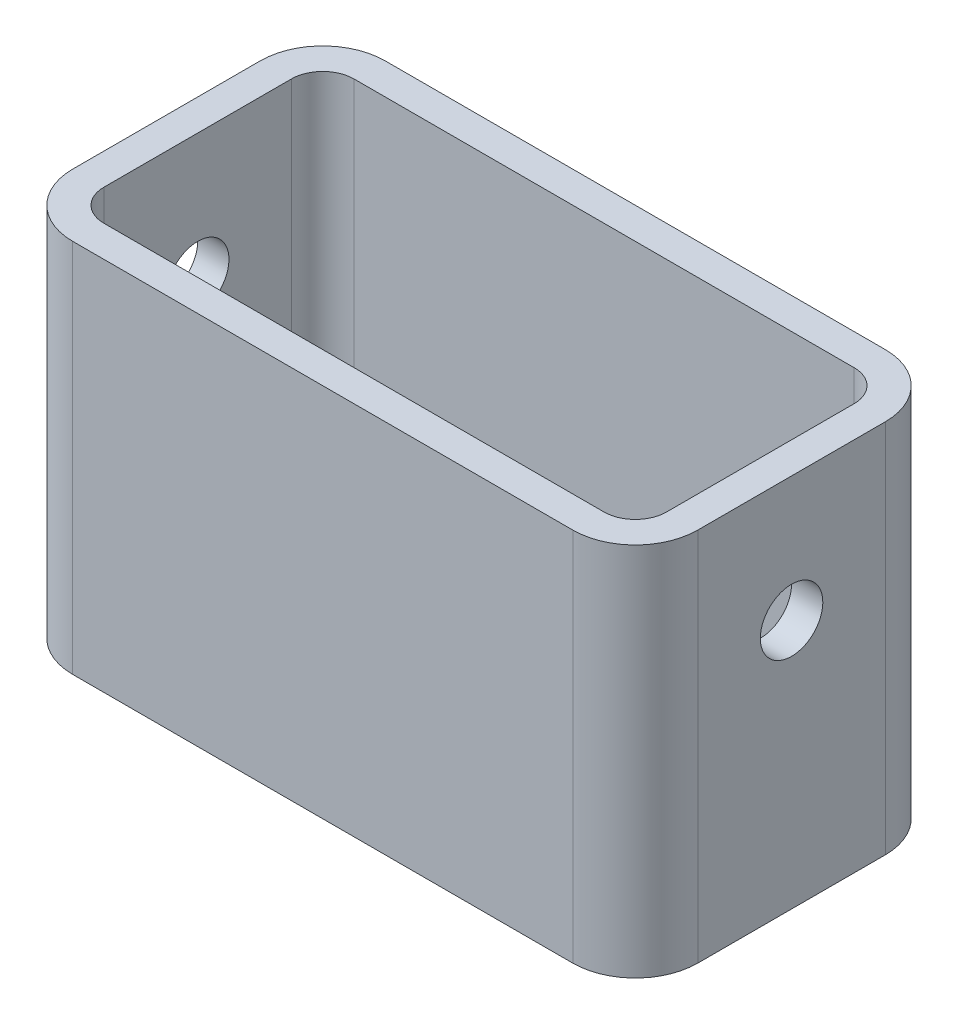
ISO-10303-21;
HEADER;
FILE_DESCRIPTION(('STEP AP214'),'2;1');
FILE_NAME('part.step','',(''),(''),'','','');
FILE_SCHEMA(('AUTOMOTIVE_DESIGN { 1 0 10303 214 1 1 1 1 }'));
ENDSEC;
DATA;
#1=APPLICATION_CONTEXT('core data for automotive mechanical design processes');
#2=APPLICATION_PROTOCOL_DEFINITION('international standard','automotive_design',2000,#1);
#3=PRODUCT_CONTEXT('',#1,'mechanical');
#4=PRODUCT('Part','Part','',(#3));
#5=PRODUCT_RELATED_PRODUCT_CATEGORY('part','',(#4));
#6=PRODUCT_DEFINITION_FORMATION('','',#4);
#7=PRODUCT_DEFINITION_CONTEXT('part definition',#1,'design');
#8=PRODUCT_DEFINITION('design','',#6,#7);
#9=PRODUCT_DEFINITION_SHAPE('','',#8);
#10=(LENGTH_UNIT() NAMED_UNIT(*) SI_UNIT(.MILLI.,.METRE.));
#11=(NAMED_UNIT(*) PLANE_ANGLE_UNIT() SI_UNIT($,.RADIAN.));
#12=(NAMED_UNIT(*) SI_UNIT($,.STERADIAN.) SOLID_ANGLE_UNIT());
#13=UNCERTAINTY_MEASURE_WITH_UNIT(LENGTH_MEASURE(1.E-05),#10,'distance_accuracy_value','');
#14=(GEOMETRIC_REPRESENTATION_CONTEXT(3) GLOBAL_UNCERTAINTY_ASSIGNED_CONTEXT((#13)) GLOBAL_UNIT_ASSIGNED_CONTEXT((#10,
#11,#12)) REPRESENTATION_CONTEXT('',''));
#15=CARTESIAN_POINT('',(0.,0.,0.));
#16=DIRECTION('',(0.,0.,1.));
#17=DIRECTION('',(1.,0.,0.));
#18=AXIS2_PLACEMENT_3D('',#15,#16,#17);
#19=CARTESIAN_POINT('',(-46.5346534653465,26.980198019802,50.));
#20=DIRECTION('',(0.,-1.,0.));
#21=DIRECTION('',(0.,0.,-1.));
#22=AXIS2_PLACEMENT_3D('',#19,#20,#21);
#23=PLANE('',#22);
#24=DIRECTION('',(0.,0.,-1.));
#25=VECTOR('',#24,1.);
#26=CARTESIAN_POINT('',(-46.5346534653465,26.980198019802,50.));
#27=LINE('',#26,#25);
#28=CARTESIAN_POINT('',(-46.5346534653465,26.980198019802,40.));
#29=VERTEX_POINT('',#28);
#30=CARTESIAN_POINT('',(-46.5346534653465,26.980198019802,10.));
#31=VERTEX_POINT('',#30);
#32=EDGE_CURVE('E237',#29,#31,#27,.T.);
#33=ORIENTED_EDGE('',*,*,#32,.F.);
#34=CARTESIAN_POINT('',(-36.5346534653465,26.980198019802,40.));
#35=DIRECTION('',(0.,-1.,0.));
#36=DIRECTION('',(0.,0.,-1.));
#37=AXIS2_PLACEMENT_3D('',#34,#35,#36);
#38=CIRCLE('',#37,10.);
#39=CARTESIAN_POINT('',(-36.5346534653465,26.980198019802,50.));
#40=VERTEX_POINT('',#39);
#41=EDGE_CURVE('E299',#29,#40,#38,.F.);
#42=ORIENTED_EDGE('',*,*,#41,.T.);
#43=DIRECTION('',(-1.,0.,0.));
#44=VECTOR('',#43,1.);
#45=CARTESIAN_POINT('',(-46.5346534653465,26.980198019802,50.));
#46=LINE('',#45,#44);
#47=CARTESIAN_POINT('',(43.4653465346535,26.980198019802,50.));
#48=VERTEX_POINT('',#47);
#49=EDGE_CURVE('E232',#48,#40,#46,.T.);
#50=ORIENTED_EDGE('',*,*,#49,.F.);
#51=CARTESIAN_POINT('',(43.4653465346535,26.980198019802,40.));
#52=DIRECTION('',(0.,-1.,0.));
#53=DIRECTION('',(0.,0.,-1.));
#54=AXIS2_PLACEMENT_3D('',#51,#52,#53);
#55=CIRCLE('',#54,10.);
#56=CARTESIAN_POINT('',(53.4653465346535,26.980198019802,40.));
#57=VERTEX_POINT('',#56);
#58=EDGE_CURVE('E263',#48,#57,#55,.F.);
#59=ORIENTED_EDGE('',*,*,#58,.T.);
#60=DIRECTION('',(0.,0.,-1.));
#61=VECTOR('',#60,1.);
#62=CARTESIAN_POINT('',(53.4653465346535,26.980198019802,50.));
#63=LINE('',#62,#61);
#64=CARTESIAN_POINT('',(53.4653465346535,26.980198019802,10.));
#65=VERTEX_POINT('',#64);
#66=EDGE_CURVE('E247',#57,#65,#63,.T.);
#67=ORIENTED_EDGE('',*,*,#66,.T.);
#68=CARTESIAN_POINT('',(43.4653465346535,26.980198019802,10.));
#69=DIRECTION('',(0.,-1.,0.));
#70=DIRECTION('',(0.,0.,-1.));
#71=AXIS2_PLACEMENT_3D('',#68,#69,#70);
#72=CIRCLE('',#71,10.);
#73=CARTESIAN_POINT('',(43.4653465346535,26.980198019802,0.));
#74=VERTEX_POINT('',#73);
#75=EDGE_CURVE('E293',#65,#74,#72,.F.);
#76=ORIENTED_EDGE('',*,*,#75,.T.);
#77=DIRECTION('',(-1.,0.,0.));
#78=VECTOR('',#77,1.);
#79=CARTESIAN_POINT('',(-46.5346534653465,26.980198019802,0.));
#80=LINE('',#79,#78);
#81=CARTESIAN_POINT('',(-36.5346534653465,26.980198019802,0.));
#82=VERTEX_POINT('',#81);
#83=EDGE_CURVE('E233',#74,#82,#80,.T.);
#84=ORIENTED_EDGE('',*,*,#83,.T.);
#85=CARTESIAN_POINT('',(-36.5346534653465,26.980198019802,10.));
#86=DIRECTION('',(0.,-1.,0.));
#87=DIRECTION('',(0.,0.,-1.));
#88=AXIS2_PLACEMENT_3D('',#85,#86,#87);
#89=CIRCLE('',#88,10.);
#90=EDGE_CURVE('E296',#82,#31,#89,.F.);
#91=ORIENTED_EDGE('',*,*,#90,.T.);
#92=EDGE_LOOP('',(#33,#42,#50,#59,#67,#76,#84,#91));
#93=FACE_BOUND('',#92,.T.);
#94=CARTESIAN_POINT('',(-36.5346534653465,26.980198019802,40.));
#95=DIRECTION('',(0.,-1.,0.));
#96=DIRECTION('',(0.,0.,-1.));
#97=AXIS2_PLACEMENT_3D('',#94,#95,#96);
#98=CIRCLE('',#97,5.);
#99=CARTESIAN_POINT('',(-41.5346534653465,26.980198019802,40.));
#100=VERTEX_POINT('',#99);
#101=CARTESIAN_POINT('',(-36.5346534653465,26.980198019802,45.));
#102=VERTEX_POINT('',#101);
#103=EDGE_CURVE('E203',#100,#102,#98,.F.);
#104=ORIENTED_EDGE('',*,*,#103,.F.);
#105=DIRECTION('',(0.,0.,-1.));
#106=VECTOR('',#105,1.);
#107=CARTESIAN_POINT('',(-41.5346534653465,26.980198019802,50.));
#108=LINE('',#107,#106);
#109=CARTESIAN_POINT('',(-41.5346534653465,26.980198019802,10.));
#110=VERTEX_POINT('',#109);
#111=EDGE_CURVE('E207',#100,#110,#108,.T.);
#112=ORIENTED_EDGE('',*,*,#111,.T.);
#113=CARTESIAN_POINT('',(-36.5346534653465,26.980198019802,10.));
#114=DIRECTION('',(0.,-1.,0.));
#115=DIRECTION('',(0.,0.,-1.));
#116=AXIS2_PLACEMENT_3D('',#113,#114,#115);
#117=CIRCLE('',#116,5.);
#118=CARTESIAN_POINT('',(-36.5346534653465,26.980198019802,5.));
#119=VERTEX_POINT('',#118);
#120=EDGE_CURVE('E214',#119,#110,#117,.F.);
#121=ORIENTED_EDGE('',*,*,#120,.F.);
#122=DIRECTION('',(-1.,0.,0.));
#123=VECTOR('',#122,1.);
#124=CARTESIAN_POINT('',(-46.5346534653465,26.980198019802,5.));
#125=LINE('',#124,#123);
#126=CARTESIAN_POINT('',(43.4653465346535,26.980198019802,5.));
#127=VERTEX_POINT('',#126);
#128=EDGE_CURVE('E55',#127,#119,#125,.T.);
#129=ORIENTED_EDGE('',*,*,#128,.F.);
#130=CARTESIAN_POINT('',(43.4653465346535,26.980198019802,10.));
#131=DIRECTION('',(0.,-1.,0.));
#132=DIRECTION('',(0.,0.,-1.));
#133=AXIS2_PLACEMENT_3D('',#130,#131,#132);
#134=CIRCLE('',#133,5.);
#135=CARTESIAN_POINT('',(48.4653465346535,26.980198019802,10.));
#136=VERTEX_POINT('',#135);
#137=EDGE_CURVE('E220',#136,#127,#134,.F.);
#138=ORIENTED_EDGE('',*,*,#137,.F.);
#139=DIRECTION('',(0.,0.,-1.));
#140=VECTOR('',#139,1.);
#141=CARTESIAN_POINT('',(48.4653465346535,26.980198019802,50.));
#142=LINE('',#141,#140);
#143=CARTESIAN_POINT('',(48.4653465346535,26.980198019802,40.));
#144=VERTEX_POINT('',#143);
#145=EDGE_CURVE('E211',#144,#136,#142,.T.);
#146=ORIENTED_EDGE('',*,*,#145,.F.);
#147=CARTESIAN_POINT('',(43.4653465346535,26.980198019802,40.));
#148=DIRECTION('',(0.,-1.,0.));
#149=DIRECTION('',(0.,0.,-1.));
#150=AXIS2_PLACEMENT_3D('',#147,#148,#149);
#151=CIRCLE('',#150,5.);
#152=CARTESIAN_POINT('',(43.4653465346535,26.980198019802,45.));
#153=VERTEX_POINT('',#152);
#154=EDGE_CURVE('E184',#153,#144,#151,.F.);
#155=ORIENTED_EDGE('',*,*,#154,.F.);
#156=DIRECTION('',(-1.,0.,0.));
#157=VECTOR('',#156,1.);
#158=CARTESIAN_POINT('',(-46.5346534653465,26.980198019802,45.));
#159=LINE('',#158,#157);
#160=EDGE_CURVE('E168',#153,#102,#159,.T.);
#161=ORIENTED_EDGE('',*,*,#160,.T.);
#162=EDGE_LOOP('',(#104,#112,#121,#129,#138,#146,#155,#161));
#163=FACE_BOUND('',#162,.T.);
#164=ADVANCED_FACE('F38',(#93,#163),#23,.F.);
#165=CARTESIAN_POINT('',(-46.5346534653465,26.980198019802,50.));
#166=DIRECTION('',(1.,0.,0.));
#167=DIRECTION('',(0.,1.,0.));
#168=AXIS2_PLACEMENT_3D('',#165,#166,#167);
#169=PLANE('',#168);
#170=CARTESIAN_POINT('',(-46.5346534653465,6.98019801980195,25.));
#171=DIRECTION('',(1.,0.,0.));
#172=DIRECTION('',(0.,1.,0.));
#173=AXIS2_PLACEMENT_3D('',#170,#171,#172);
#174=CIRCLE('',#173,5.);
#175=CARTESIAN_POINT('',(-46.5346534653465,11.980198019802,25.));
#176=VERTEX_POINT('',#175);
#177=EDGE_CURVE('E354',#176,#176,#174,.T.);
#178=ORIENTED_EDGE('',*,*,#177,.T.);
#179=EDGE_LOOP('',(#178));
#180=FACE_BOUND('',#179,.T.);
#181=DIRECTION('',(0.,0.,-1.));
#182=VECTOR('',#181,1.);
#183=CARTESIAN_POINT('',(-46.5346534653465,-33.019801980198,50.));
#184=LINE('',#183,#182);
#185=CARTESIAN_POINT('',(-46.5346534653465,-33.019801980198,40.));
#186=VERTEX_POINT('',#185);
#187=CARTESIAN_POINT('',(-46.5346534653465,-33.019801980198,10.));
#188=VERTEX_POINT('',#187);
#189=EDGE_CURVE('E255',#186,#188,#184,.T.);
#190=ORIENTED_EDGE('',*,*,#189,.F.);
#191=DIRECTION('',(0.,-1.,0.));
#192=VECTOR('',#191,1.);
#193=CARTESIAN_POINT('',(-46.5346534653465,26.980198019802,40.));
#194=LINE('',#193,#192);
#195=EDGE_CURVE('E290',#186,#29,#194,.F.);
#196=ORIENTED_EDGE('',*,*,#195,.T.);
#197=ORIENTED_EDGE('',*,*,#32,.T.);
#198=DIRECTION('',(0.,-1.,0.));
#199=VECTOR('',#198,1.);
#200=CARTESIAN_POINT('',(-46.5346534653465,26.980198019802,10.));
#201=LINE('',#200,#199);
#202=EDGE_CURVE('E286',#31,#188,#201,.T.);
#203=ORIENTED_EDGE('',*,*,#202,.T.);
#204=EDGE_LOOP('',(#190,#196,#197,#203));
#205=FACE_BOUND('',#204,.T.);
#206=ADVANCED_FACE('F364',(#180,#205),#169,.F.);
#207=CARTESIAN_POINT('',(-46.5346534653465,-33.019801980198,50.));
#208=DIRECTION('',(0.,1.,0.));
#209=DIRECTION('',(0.,0.,1.));
#210=AXIS2_PLACEMENT_3D('',#207,#208,#209);
#211=PLANE('',#210);
#212=DIRECTION('',(1.,0.,0.));
#213=VECTOR('',#212,1.);
#214=CARTESIAN_POINT('',(-46.5346534653465,-33.019801980198,50.));
#215=LINE('',#214,#213);
#216=CARTESIAN_POINT('',(-36.5346534653465,-33.019801980198,50.));
#217=VERTEX_POINT('',#216);
#218=CARTESIAN_POINT('',(43.4653465346535,-33.019801980198,50.));
#219=VERTEX_POINT('',#218);
#220=EDGE_CURVE('E229',#217,#219,#215,.T.);
#221=ORIENTED_EDGE('',*,*,#220,.F.);
#222=CARTESIAN_POINT('',(-36.5346534653465,-33.019801980198,40.));
#223=DIRECTION('',(0.,1.,0.));
#224=DIRECTION('',(0.,0.,1.));
#225=AXIS2_PLACEMENT_3D('',#222,#223,#224);
#226=CIRCLE('',#225,10.);
#227=EDGE_CURVE('E283',#217,#186,#226,.F.);
#228=ORIENTED_EDGE('',*,*,#227,.T.);
#229=ORIENTED_EDGE('',*,*,#189,.T.);
#230=CARTESIAN_POINT('',(-36.5346534653465,-33.019801980198,10.));
#231=DIRECTION('',(0.,1.,0.));
#232=DIRECTION('',(0.,0.,1.));
#233=AXIS2_PLACEMENT_3D('',#230,#231,#232);
#234=CIRCLE('',#233,10.);
#235=CARTESIAN_POINT('',(-36.5346534653465,-33.019801980198,0.));
#236=VERTEX_POINT('',#235);
#237=EDGE_CURVE('E280',#188,#236,#234,.F.);
#238=ORIENTED_EDGE('',*,*,#237,.T.);
#239=DIRECTION('',(1.,0.,0.));
#240=VECTOR('',#239,1.);
#241=CARTESIAN_POINT('',(-46.5346534653465,-33.019801980198,0.));
#242=LINE('',#241,#240);
#243=CARTESIAN_POINT('',(43.4653465346535,-33.019801980198,0.));
#244=VERTEX_POINT('',#243);
#245=EDGE_CURVE('E238',#236,#244,#242,.T.);
#246=ORIENTED_EDGE('',*,*,#245,.T.);
#247=CARTESIAN_POINT('',(43.4653465346535,-33.019801980198,10.));
#248=DIRECTION('',(0.,1.,0.));
#249=DIRECTION('',(0.,0.,1.));
#250=AXIS2_PLACEMENT_3D('',#247,#248,#249);
#251=CIRCLE('',#250,10.);
#252=CARTESIAN_POINT('',(53.4653465346535,-33.019801980198,10.));
#253=VERTEX_POINT('',#252);
#254=EDGE_CURVE('E277',#244,#253,#251,.F.);
#255=ORIENTED_EDGE('',*,*,#254,.T.);
#256=DIRECTION('',(0.,0.,-1.));
#257=VECTOR('',#256,1.);
#258=CARTESIAN_POINT('',(53.4653465346535,-33.019801980198,50.));
#259=LINE('',#258,#257);
#260=CARTESIAN_POINT('',(53.4653465346535,-33.019801980198,40.));
#261=VERTEX_POINT('',#260);
#262=EDGE_CURVE('E251',#261,#253,#259,.T.);
#263=ORIENTED_EDGE('',*,*,#262,.F.);
#264=CARTESIAN_POINT('',(43.4653465346535,-33.019801980198,40.));
#265=DIRECTION('',(0.,1.,0.));
#266=DIRECTION('',(0.,0.,1.));
#267=AXIS2_PLACEMENT_3D('',#264,#265,#266);
#268=CIRCLE('',#267,10.);
#269=EDGE_CURVE('E269',#261,#219,#268,.F.);
#270=ORIENTED_EDGE('',*,*,#269,.T.);
#271=EDGE_LOOP('',(#221,#228,#229,#238,#246,#255,#263,#270));
#272=FACE_BOUND('',#271,.T.);
#273=ADVANCED_FACE('F384',(#272),#211,.F.);
#274=CARTESIAN_POINT('',(53.4653465346535,26.980198019802,50.));
#275=DIRECTION('',(-1.,0.,0.));
#276=DIRECTION('',(0.,-1.,0.));
#277=AXIS2_PLACEMENT_3D('',#274,#275,#276);
#278=PLANE('',#277);
#279=CARTESIAN_POINT('',(53.4653465346535,6.98019801980198,25.));
#280=DIRECTION('',(1.,0.,0.));
#281=DIRECTION('',(0.,1.,0.));
#282=AXIS2_PLACEMENT_3D('',#279,#280,#281);
#283=CIRCLE('',#282,5.);
#284=CARTESIAN_POINT('',(53.4653465346535,11.980198019802,25.));
#285=VERTEX_POINT('',#284);
#286=EDGE_CURVE('E356',#285,#285,#283,.T.);
#287=ORIENTED_EDGE('',*,*,#286,.F.);
#288=EDGE_LOOP('',(#287));
#289=FACE_BOUND('',#288,.T.);
#290=ORIENTED_EDGE('',*,*,#262,.T.);
#291=DIRECTION('',(0.,1.,0.));
#292=VECTOR('',#291,1.);
#293=CARTESIAN_POINT('',(53.4653465346535,26.980198019802,10.));
#294=LINE('',#293,#292);
#295=EDGE_CURVE('E11',#253,#65,#294,.T.);
#296=ORIENTED_EDGE('',*,*,#295,.T.);
#297=ORIENTED_EDGE('',*,*,#66,.F.);
#298=DIRECTION('',(0.,1.,0.));
#299=VECTOR('',#298,1.);
#300=CARTESIAN_POINT('',(53.4653465346535,-33.019801980198,40.));
#301=LINE('',#300,#299);
#302=EDGE_CURVE('E266',#57,#261,#301,.F.);
#303=ORIENTED_EDGE('',*,*,#302,.T.);
#304=EDGE_LOOP('',(#290,#296,#297,#303));
#305=FACE_BOUND('',#304,.T.);
#306=ADVANCED_FACE('F391',(#289,#305),#278,.F.);
#307=CARTESIAN_POINT('',(0.,0.,50.));
#308=DIRECTION('',(0.,0.,1.));
#309=DIRECTION('',(1.,0.,0.));
#310=AXIS2_PLACEMENT_3D('',#307,#308,#309);
#311=PLANE('',#310);
#312=ORIENTED_EDGE('',*,*,#49,.T.);
#313=DIRECTION('',(0.,-1.,0.));
#314=VECTOR('',#313,1.);
#315=CARTESIAN_POINT('',(-36.5346534653465,-33.019801980198,50.));
#316=LINE('',#315,#314);
#317=EDGE_CURVE('E273',#40,#217,#316,.T.);
#318=ORIENTED_EDGE('',*,*,#317,.T.);
#319=ORIENTED_EDGE('',*,*,#220,.T.);
#320=DIRECTION('',(0.,1.,0.));
#321=VECTOR('',#320,1.);
#322=CARTESIAN_POINT('',(43.4653465346535,26.980198019802,50.));
#323=LINE('',#322,#321);
#324=EDGE_CURVE('E259',#219,#48,#323,.T.);
#325=ORIENTED_EDGE('',*,*,#324,.T.);
#326=EDGE_LOOP('',(#312,#318,#319,#325));
#327=FACE_BOUND('',#326,.T.);
#328=ADVANCED_FACE('F394',(#327),#311,.T.);
#329=CARTESIAN_POINT('',(0.,0.,0.));
#330=DIRECTION('',(0.,0.,1.));
#331=DIRECTION('',(1.,0.,0.));
#332=AXIS2_PLACEMENT_3D('',#329,#330,#331);
#333=PLANE('',#332);
#334=ORIENTED_EDGE('',*,*,#245,.F.);
#335=DIRECTION('',(0.,-1.,0.));
#336=VECTOR('',#335,1.);
#337=CARTESIAN_POINT('',(-36.5346534653465,0.,0.));
#338=LINE('',#337,#336);
#339=EDGE_CURVE('E48',#236,#82,#338,.F.);
#340=ORIENTED_EDGE('',*,*,#339,.T.);
#341=ORIENTED_EDGE('',*,*,#83,.F.);
#342=DIRECTION('',(0.,1.,0.));
#343=VECTOR('',#342,1.);
#344=CARTESIAN_POINT('',(43.4653465346535,0.,0.));
#345=LINE('',#344,#343);
#346=EDGE_CURVE('E302',#74,#244,#345,.F.);
#347=ORIENTED_EDGE('',*,*,#346,.T.);
#348=EDGE_LOOP('',(#334,#340,#341,#347));
#349=FACE_BOUND('',#348,.T.);
#350=ADVANCED_FACE('F389',(#349),#333,.F.);
#351=CARTESIAN_POINT('',(43.4653465346535,0.,40.));
#352=DIRECTION('',(0.,-1.,0.));
#353=DIRECTION('',(1.,0.,0.));
#354=AXIS2_PLACEMENT_3D('',#351,#352,#353);
#355=CYLINDRICAL_SURFACE('',#354,10.);
#356=ORIENTED_EDGE('',*,*,#269,.F.);
#357=ORIENTED_EDGE('',*,*,#302,.F.);
#358=ORIENTED_EDGE('',*,*,#58,.F.);
#359=ORIENTED_EDGE('',*,*,#324,.F.);
#360=EDGE_LOOP('',(#356,#357,#358,#359));
#361=FACE_BOUND('',#360,.T.);
#362=ADVANCED_FACE('F399',(#361),#355,.T.);
#363=CARTESIAN_POINT('',(-36.5346534653465,0.,40.));
#364=DIRECTION('',(0.,1.,0.));
#365=DIRECTION('',(-1.,0.,0.));
#366=AXIS2_PLACEMENT_3D('',#363,#364,#365);
#367=CYLINDRICAL_SURFACE('',#366,10.);
#368=ORIENTED_EDGE('',*,*,#41,.F.);
#369=ORIENTED_EDGE('',*,*,#195,.F.);
#370=ORIENTED_EDGE('',*,*,#227,.F.);
#371=ORIENTED_EDGE('',*,*,#317,.F.);
#372=EDGE_LOOP('',(#368,#369,#370,#371));
#373=FACE_BOUND('',#372,.T.);
#374=ADVANCED_FACE('F402',(#373),#367,.T.);
#375=CARTESIAN_POINT('',(-36.5346534653465,26.980198019802,10.));
#376=DIRECTION('',(0.,-1.,0.));
#377=DIRECTION('',(1.,0.,0.));
#378=AXIS2_PLACEMENT_3D('',#375,#376,#377);
#379=CYLINDRICAL_SURFACE('',#378,10.);
#380=ORIENTED_EDGE('',*,*,#90,.F.);
#381=ORIENTED_EDGE('',*,*,#339,.F.);
#382=ORIENTED_EDGE('',*,*,#237,.F.);
#383=ORIENTED_EDGE('',*,*,#202,.F.);
#384=EDGE_LOOP('',(#380,#381,#382,#383));
#385=FACE_BOUND('',#384,.T.);
#386=ADVANCED_FACE('F405',(#385),#379,.T.);
#387=CARTESIAN_POINT('',(43.4653465346535,26.980198019802,10.));
#388=DIRECTION('',(0.,1.,0.));
#389=DIRECTION('',(-1.,0.,0.));
#390=AXIS2_PLACEMENT_3D('',#387,#388,#389);
#391=CYLINDRICAL_SURFACE('',#390,10.);
#392=ORIENTED_EDGE('',*,*,#254,.F.);
#393=ORIENTED_EDGE('',*,*,#346,.F.);
#394=ORIENTED_EDGE('',*,*,#75,.F.);
#395=ORIENTED_EDGE('',*,*,#295,.F.);
#396=EDGE_LOOP('',(#392,#393,#394,#395));
#397=FACE_BOUND('',#396,.T.);
#398=ADVANCED_FACE('F40',(#397),#391,.T.);
#399=CARTESIAN_POINT('',(-41.5346534653465,26.980198019802,50.));
#400=DIRECTION('',(1.,0.,0.));
#401=DIRECTION('',(0.,1.,0.));
#402=AXIS2_PLACEMENT_3D('',#399,#400,#401);
#403=PLANE('',#402);
#404=CARTESIAN_POINT('',(-41.5346534653465,6.98019801980196,25.));
#405=DIRECTION('',(1.,0.,0.));
#406=DIRECTION('',(0.,1.,0.));
#407=AXIS2_PLACEMENT_3D('',#404,#405,#406);
#408=CIRCLE('',#407,5.);
#409=CARTESIAN_POINT('',(-41.5346534653465,11.980198019802,25.));
#410=VERTEX_POINT('',#409);
#411=EDGE_CURVE('E346',#410,#410,#408,.T.);
#412=ORIENTED_EDGE('',*,*,#411,.F.);
#413=EDGE_LOOP('',(#412));
#414=FACE_BOUND('',#413,.T.);
#415=DIRECTION('',(0.,0.,-1.));
#416=VECTOR('',#415,1.);
#417=CARTESIAN_POINT('',(-41.5346534653465,-28.019801980198,50.));
#418=LINE('',#417,#416);
#419=CARTESIAN_POINT('',(-41.5346534653465,-28.019801980198,40.));
#420=VERTEX_POINT('',#419);
#421=CARTESIAN_POINT('',(-41.5346534653465,-28.019801980198,10.));
#422=VERTEX_POINT('',#421);
#423=EDGE_CURVE('E185',#420,#422,#418,.T.);
#424=ORIENTED_EDGE('',*,*,#423,.T.);
#425=DIRECTION('',(0.,1.,0.));
#426=VECTOR('',#425,1.);
#427=CARTESIAN_POINT('',(-41.5346534653465,26.980198019802,10.));
#428=LINE('',#427,#426);
#429=EDGE_CURVE('E309',#110,#422,#428,.F.);
#430=ORIENTED_EDGE('',*,*,#429,.F.);
#431=ORIENTED_EDGE('',*,*,#111,.F.);
#432=DIRECTION('',(0.,1.,0.));
#433=VECTOR('',#432,1.);
#434=CARTESIAN_POINT('',(-41.5346534653465,26.980198019802,40.));
#435=LINE('',#434,#433);
#436=EDGE_CURVE('E223',#420,#100,#435,.T.);
#437=ORIENTED_EDGE('',*,*,#436,.F.);
#438=EDGE_LOOP('',(#424,#430,#431,#437));
#439=FACE_BOUND('',#438,.T.);
#440=ADVANCED_FACE('F343',(#414,#439),#403,.T.);
#441=CARTESIAN_POINT('',(-46.5346534653465,-28.019801980198,50.));
#442=DIRECTION('',(0.,1.,0.));
#443=DIRECTION('',(0.,0.,1.));
#444=AXIS2_PLACEMENT_3D('',#441,#442,#443);
#445=PLANE('',#444);
#446=DIRECTION('',(1.,0.,0.));
#447=VECTOR('',#446,1.);
#448=CARTESIAN_POINT('',(-46.5346534653465,-28.019801980198,45.));
#449=LINE('',#448,#447);
#450=CARTESIAN_POINT('',(-36.5346534653465,-28.019801980198,45.));
#451=VERTEX_POINT('',#450);
#452=CARTESIAN_POINT('',(43.4653465346535,-28.019801980198,45.));
#453=VERTEX_POINT('',#452);
#454=EDGE_CURVE('E156',#451,#453,#449,.T.);
#455=ORIENTED_EDGE('',*,*,#454,.T.);
#456=CARTESIAN_POINT('',(43.4653465346535,-28.019801980198,40.));
#457=DIRECTION('',(0.,1.,0.));
#458=DIRECTION('',(0.,0.,1.));
#459=AXIS2_PLACEMENT_3D('',#456,#457,#458);
#460=CIRCLE('',#459,5.);
#461=CARTESIAN_POINT('',(48.4653465346535,-28.019801980198,40.));
#462=VERTEX_POINT('',#461);
#463=EDGE_CURVE('E160',#462,#453,#460,.F.);
#464=ORIENTED_EDGE('',*,*,#463,.F.);
#465=DIRECTION('',(0.,0.,-1.));
#466=VECTOR('',#465,1.);
#467=CARTESIAN_POINT('',(48.4653465346535,-28.019801980198,50.));
#468=LINE('',#467,#466);
#469=CARTESIAN_POINT('',(48.4653465346535,-28.019801980198,10.));
#470=VERTEX_POINT('',#469);
#471=EDGE_CURVE('E191',#462,#470,#468,.T.);
#472=ORIENTED_EDGE('',*,*,#471,.T.);
#473=CARTESIAN_POINT('',(43.4653465346535,-28.019801980198,10.));
#474=DIRECTION('',(0.,1.,0.));
#475=DIRECTION('',(0.,0.,1.));
#476=AXIS2_PLACEMENT_3D('',#473,#474,#475);
#477=CIRCLE('',#476,5.);
#478=CARTESIAN_POINT('',(43.4653465346535,-28.019801980198,5.));
#479=VERTEX_POINT('',#478);
#480=EDGE_CURVE('E198',#479,#470,#477,.F.);
#481=ORIENTED_EDGE('',*,*,#480,.F.);
#482=DIRECTION('',(1.,0.,0.));
#483=VECTOR('',#482,1.);
#484=CARTESIAN_POINT('',(-46.5346534653465,-28.019801980198,5.));
#485=LINE('',#484,#483);
#486=CARTESIAN_POINT('',(-36.5346534653465,-28.019801980198,5.));
#487=VERTEX_POINT('',#486);
#488=EDGE_CURVE('E226',#487,#479,#485,.T.);
#489=ORIENTED_EDGE('',*,*,#488,.F.);
#490=CARTESIAN_POINT('',(-36.5346534653465,-28.019801980198,10.));
#491=DIRECTION('',(0.,1.,0.));
#492=DIRECTION('',(0.,0.,1.));
#493=AXIS2_PLACEMENT_3D('',#490,#491,#492);
#494=CIRCLE('',#493,5.);
#495=EDGE_CURVE('E315',#422,#487,#494,.F.);
#496=ORIENTED_EDGE('',*,*,#495,.F.);
#497=ORIENTED_EDGE('',*,*,#423,.F.);
#498=CARTESIAN_POINT('',(-36.5346534653465,-28.019801980198,40.));
#499=DIRECTION('',(0.,1.,0.));
#500=DIRECTION('',(0.,0.,1.));
#501=AXIS2_PLACEMENT_3D('',#498,#499,#500);
#502=CIRCLE('',#501,5.);
#503=EDGE_CURVE('E162',#451,#420,#502,.F.);
#504=ORIENTED_EDGE('',*,*,#503,.F.);
#505=EDGE_LOOP('',(#455,#464,#472,#481,#489,#496,#497,#504));
#506=FACE_BOUND('',#505,.T.);
#507=ADVANCED_FACE('F158',(#506),#445,.T.);
#508=CARTESIAN_POINT('',(48.4653465346535,26.980198019802,50.));
#509=DIRECTION('',(-1.,0.,0.));
#510=DIRECTION('',(0.,-1.,0.));
#511=AXIS2_PLACEMENT_3D('',#508,#509,#510);
#512=PLANE('',#511);
#513=CARTESIAN_POINT('',(48.4653465346535,6.98019801980198,25.));
#514=DIRECTION('',(-1.,0.,0.));
#515=DIRECTION('',(0.,-1.,0.));
#516=AXIS2_PLACEMENT_3D('',#513,#514,#515);
#517=CIRCLE('',#516,5.);
#518=CARTESIAN_POINT('',(48.4653465346535,1.98019801980198,25.));
#519=VERTEX_POINT('',#518);
#520=EDGE_CURVE('E42',#519,#519,#517,.T.);
#521=ORIENTED_EDGE('',*,*,#520,.F.);
#522=EDGE_LOOP('',(#521));
#523=FACE_BOUND('',#522,.T.);
#524=ORIENTED_EDGE('',*,*,#471,.F.);
#525=DIRECTION('',(0.,-1.,0.));
#526=VECTOR('',#525,1.);
#527=CARTESIAN_POINT('',(48.4653465346535,26.980198019802,40.));
#528=LINE('',#527,#526);
#529=EDGE_CURVE('E175',#144,#462,#528,.T.);
#530=ORIENTED_EDGE('',*,*,#529,.F.);
#531=ORIENTED_EDGE('',*,*,#145,.T.);
#532=DIRECTION('',(0.,-1.,0.));
#533=VECTOR('',#532,1.);
#534=CARTESIAN_POINT('',(48.4653465346535,26.980198019802,10.));
#535=LINE('',#534,#533);
#536=EDGE_CURVE('E206',#470,#136,#535,.F.);
#537=ORIENTED_EDGE('',*,*,#536,.F.);
#538=EDGE_LOOP('',(#524,#530,#531,#537));
#539=FACE_BOUND('',#538,.T.);
#540=ADVANCED_FACE('F329',(#523,#539),#512,.T.);
#541=CARTESIAN_POINT('',(0.,0.,45.));
#542=DIRECTION('',(0.,0.,1.));
#543=DIRECTION('',(1.,0.,0.));
#544=AXIS2_PLACEMENT_3D('',#541,#542,#543);
#545=PLANE('',#544);
#546=ORIENTED_EDGE('',*,*,#160,.F.);
#547=DIRECTION('',(0.,1.,0.));
#548=VECTOR('',#547,1.);
#549=CARTESIAN_POINT('',(43.4653465346535,0.,45.));
#550=LINE('',#549,#548);
#551=EDGE_CURVE('E172',#453,#153,#550,.T.);
#552=ORIENTED_EDGE('',*,*,#551,.F.);
#553=ORIENTED_EDGE('',*,*,#454,.F.);
#554=DIRECTION('',(0.,1.,0.));
#555=VECTOR('',#554,1.);
#556=CARTESIAN_POINT('',(-36.5346534653465,0.,45.));
#557=LINE('',#556,#555);
#558=EDGE_CURVE('E178',#102,#451,#557,.F.);
#559=ORIENTED_EDGE('',*,*,#558,.F.);
#560=EDGE_LOOP('',(#546,#552,#553,#559));
#561=FACE_BOUND('',#560,.T.);
#562=ADVANCED_FACE('F180',(#561),#545,.F.);
#563=CARTESIAN_POINT('',(0.,0.,5.));
#564=DIRECTION('',(0.,0.,1.));
#565=DIRECTION('',(1.,0.,0.));
#566=AXIS2_PLACEMENT_3D('',#563,#564,#565);
#567=PLANE('',#566);
#568=ORIENTED_EDGE('',*,*,#488,.T.);
#569=DIRECTION('',(0.,1.,0.));
#570=VECTOR('',#569,1.);
#571=CARTESIAN_POINT('',(43.4653465346535,0.,5.));
#572=LINE('',#571,#570);
#573=EDGE_CURVE('E199',#127,#479,#572,.F.);
#574=ORIENTED_EDGE('',*,*,#573,.F.);
#575=ORIENTED_EDGE('',*,*,#128,.T.);
#576=DIRECTION('',(0.,1.,0.));
#577=VECTOR('',#576,1.);
#578=CARTESIAN_POINT('',(-36.5346534653465,0.,5.));
#579=LINE('',#578,#577);
#580=EDGE_CURVE('E202',#487,#119,#579,.T.);
#581=ORIENTED_EDGE('',*,*,#580,.F.);
#582=EDGE_LOOP('',(#568,#574,#575,#581));
#583=FACE_BOUND('',#582,.T.);
#584=ADVANCED_FACE('F335',(#583),#567,.T.);
#585=CARTESIAN_POINT('',(43.4653465346535,0.,40.));
#586=DIRECTION('',(0.,-1.,0.));
#587=DIRECTION('',(1.,0.,0.));
#588=AXIS2_PLACEMENT_3D('',#585,#586,#587);
#589=CYLINDRICAL_SURFACE('',#588,5.);
#590=ORIENTED_EDGE('',*,*,#463,.T.);
#591=ORIENTED_EDGE('',*,*,#551,.T.);
#592=ORIENTED_EDGE('',*,*,#154,.T.);
#593=ORIENTED_EDGE('',*,*,#529,.T.);
#594=EDGE_LOOP('',(#590,#591,#592,#593));
#595=FACE_BOUND('',#594,.T.);
#596=ADVANCED_FACE('F171',(#595),#589,.F.);
#597=CARTESIAN_POINT('',(-36.5346534653465,0.,40.));
#598=DIRECTION('',(0.,1.,0.));
#599=DIRECTION('',(-1.,0.,0.));
#600=AXIS2_PLACEMENT_3D('',#597,#598,#599);
#601=CYLINDRICAL_SURFACE('',#600,5.);
#602=ORIENTED_EDGE('',*,*,#103,.T.);
#603=ORIENTED_EDGE('',*,*,#558,.T.);
#604=ORIENTED_EDGE('',*,*,#503,.T.);
#605=ORIENTED_EDGE('',*,*,#436,.T.);
#606=EDGE_LOOP('',(#602,#603,#604,#605));
#607=FACE_BOUND('',#606,.T.);
#608=ADVANCED_FACE('F443',(#607),#601,.F.);
#609=CARTESIAN_POINT('',(-36.5346534653465,26.980198019802,10.));
#610=DIRECTION('',(0.,-1.,0.));
#611=DIRECTION('',(1.,0.,0.));
#612=AXIS2_PLACEMENT_3D('',#609,#610,#611);
#613=CYLINDRICAL_SURFACE('',#612,5.);
#614=ORIENTED_EDGE('',*,*,#120,.T.);
#615=ORIENTED_EDGE('',*,*,#429,.T.);
#616=ORIENTED_EDGE('',*,*,#495,.T.);
#617=ORIENTED_EDGE('',*,*,#580,.T.);
#618=EDGE_LOOP('',(#614,#615,#616,#617));
#619=FACE_BOUND('',#618,.T.);
#620=ADVANCED_FACE('F341',(#619),#613,.F.);
#621=CARTESIAN_POINT('',(43.4653465346535,26.980198019802,10.));
#622=DIRECTION('',(0.,1.,0.));
#623=DIRECTION('',(-1.,0.,0.));
#624=AXIS2_PLACEMENT_3D('',#621,#622,#623);
#625=CYLINDRICAL_SURFACE('',#624,5.);
#626=ORIENTED_EDGE('',*,*,#480,.T.);
#627=ORIENTED_EDGE('',*,*,#536,.T.);
#628=ORIENTED_EDGE('',*,*,#137,.T.);
#629=ORIENTED_EDGE('',*,*,#573,.T.);
#630=EDGE_LOOP('',(#626,#627,#628,#629));
#631=FACE_BOUND('',#630,.T.);
#632=ADVANCED_FACE('F332',(#631),#625,.F.);
#633=CARTESIAN_POINT('',(-46.5346534653465,6.98019801980195,25.));
#634=DIRECTION('',(1.,0.,0.));
#635=DIRECTION('',(0.,1.,0.));
#636=AXIS2_PLACEMENT_3D('',#633,#634,#635);
#637=CYLINDRICAL_SURFACE('',#636,5.);
#638=ORIENTED_EDGE('',*,*,#520,.T.);
#639=EDGE_LOOP('',(#638));
#640=FACE_BOUND('',#639,.T.);
#641=ORIENTED_EDGE('',*,*,#286,.T.);
#642=EDGE_LOOP('',(#641));
#643=FACE_BOUND('',#642,.T.);
#644=ADVANCED_FACE('F369',(#640,#643),#637,.F.);
#645=ORIENTED_EDGE('',*,*,#411,.T.);
#646=EDGE_LOOP('',(#645));
#647=FACE_BOUND('',#646,.T.);
#648=ORIENTED_EDGE('',*,*,#177,.F.);
#649=EDGE_LOOP('',(#648));
#650=FACE_BOUND('',#649,.T.);
#651=ADVANCED_FACE('F367',(#647,#650),#637,.F.);
#652=CLOSED_SHELL('',(#164,#206,#273,#306,#328,#350,#362,#374,#386,#398,#440,#507,#540,#562,
#584,#596,#608,#620,#632,#644,#651));
#653=MANIFOLD_SOLID_BREP('B2',#652);
#654=ADVANCED_BREP_SHAPE_REPRESENTATION('',(#18,#653),#14);
#655=SHAPE_DEFINITION_REPRESENTATION(#9,#654);
ENDSEC;
END-ISO-10303-21;
